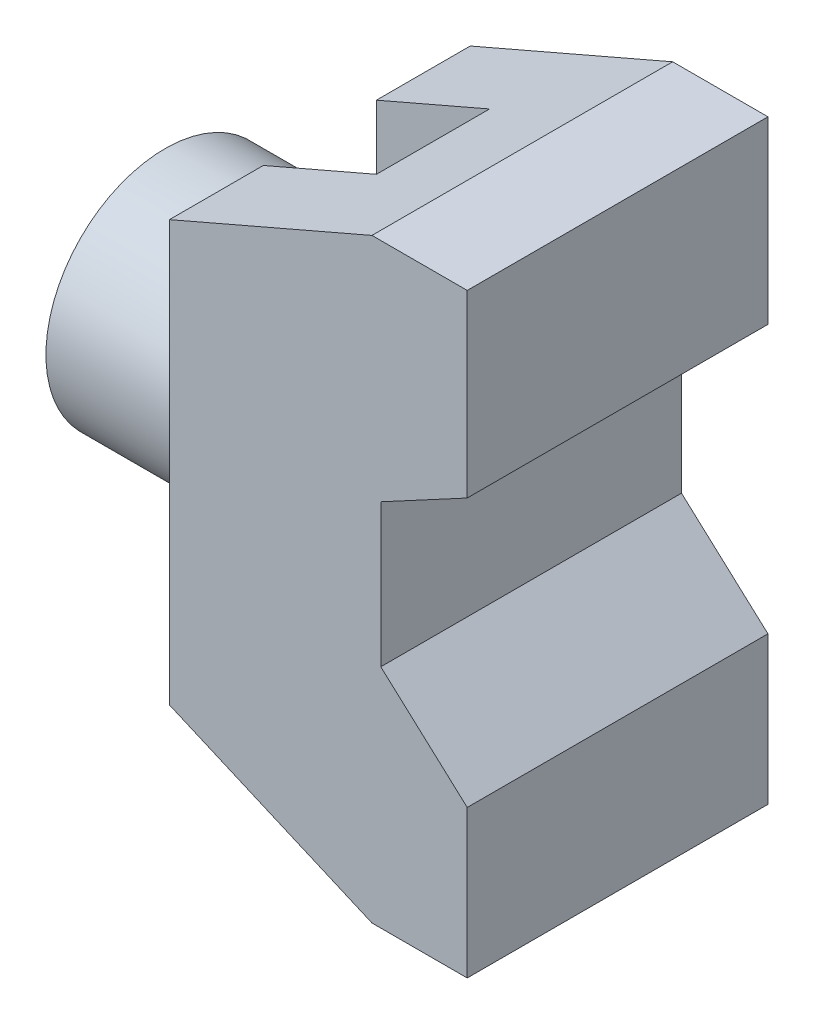
ISO-10303-21;
HEADER;
FILE_DESCRIPTION(('STEP AP214'),'2;1');
FILE_NAME('part.step','',(''),(''),'','','');
FILE_SCHEMA(('AUTOMOTIVE_DESIGN { 1 0 10303 214 1 1 1 1 }'));
ENDSEC;
DATA;
#1=APPLICATION_CONTEXT('core data for automotive mechanical design processes');
#2=APPLICATION_PROTOCOL_DEFINITION('international standard','automotive_design',2000,#1);
#3=PRODUCT_CONTEXT('',#1,'mechanical');
#4=PRODUCT('Part','Part','',(#3));
#5=PRODUCT_RELATED_PRODUCT_CATEGORY('part','',(#4));
#6=PRODUCT_DEFINITION_FORMATION('','',#4);
#7=PRODUCT_DEFINITION_CONTEXT('part definition',#1,'design');
#8=PRODUCT_DEFINITION('design','',#6,#7);
#9=PRODUCT_DEFINITION_SHAPE('','',#8);
#10=(LENGTH_UNIT() NAMED_UNIT(*) SI_UNIT(.MILLI.,.METRE.));
#11=(NAMED_UNIT(*) PLANE_ANGLE_UNIT() SI_UNIT($,.RADIAN.));
#12=(NAMED_UNIT(*) SI_UNIT($,.STERADIAN.) SOLID_ANGLE_UNIT());
#13=UNCERTAINTY_MEASURE_WITH_UNIT(LENGTH_MEASURE(1.E-05),#10,'distance_accuracy_value','');
#14=(GEOMETRIC_REPRESENTATION_CONTEXT(3) GLOBAL_UNCERTAINTY_ASSIGNED_CONTEXT((#13)) GLOBAL_UNIT_ASSIGNED_CONTEXT((#10,
#11,#12)) REPRESENTATION_CONTEXT('',''));
#15=CARTESIAN_POINT('',(0.,0.,0.));
#16=DIRECTION('',(0.,0.,1.));
#17=DIRECTION('',(1.,0.,0.));
#18=AXIS2_PLACEMENT_3D('',#15,#16,#17);
#19=CARTESIAN_POINT('',(76.,0.,0.));
#20=DIRECTION('',(1.,0.,0.));
#21=DIRECTION('',(0.,0.,-1.));
#22=AXIS2_PLACEMENT_3D('',#19,#20,#21);
#23=PLANE('',#22);
#24=DIRECTION('',(0.,0.,-1.));
#25=VECTOR('',#24,1.);
#26=CARTESIAN_POINT('',(76.,-25.1927502263372,25.25));
#27=LINE('',#26,#25);
#28=CARTESIAN_POINT('',(76.,-25.1927502263372,25.25));
#29=VERTEX_POINT('',#28);
#30=CARTESIAN_POINT('',(76.,-25.1927502263372,-25.25));
#31=VERTEX_POINT('',#30);
#32=EDGE_CURVE('E192',#29,#31,#27,.T.);
#33=ORIENTED_EDGE('',*,*,#32,.F.);
#34=DIRECTION('',(0.,-1.,0.));
#35=VECTOR('',#34,1.);
#36=CARTESIAN_POINT('',(76.,50.,25.25));
#37=LINE('',#36,#35);
#38=CARTESIAN_POINT('',(76.,-50.,25.25));
#39=VERTEX_POINT('',#38);
#40=EDGE_CURVE('E184',#29,#39,#37,.T.);
#41=ORIENTED_EDGE('',*,*,#40,.T.);
#42=DIRECTION('',(0.,0.,-1.));
#43=VECTOR('',#42,1.);
#44=CARTESIAN_POINT('',(76.,-50.,25.25));
#45=LINE('',#44,#43);
#46=CARTESIAN_POINT('',(76.,-50.,-25.25));
#47=VERTEX_POINT('',#46);
#48=EDGE_CURVE('E252',#39,#47,#45,.T.);
#49=ORIENTED_EDGE('',*,*,#48,.T.);
#50=DIRECTION('',(0.,1.,0.));
#51=VECTOR('',#50,1.);
#52=CARTESIAN_POINT('',(76.,50.,-25.25));
#53=LINE('',#52,#51);
#54=EDGE_CURVE('E243',#47,#31,#53,.T.);
#55=ORIENTED_EDGE('',*,*,#54,.T.);
#56=EDGE_LOOP('',(#33,#41,#49,#55));
#57=FACE_BOUND('',#56,.T.);
#58=ADVANCED_FACE('F37',(#57),#23,.T.);
#59=CARTESIAN_POINT('',(26.,0.,0.));
#60=DIRECTION('',(1.,0.,0.));
#61=DIRECTION('',(0.,0.,-1.));
#62=AXIS2_PLACEMENT_3D('',#59,#60,#61);
#63=PLANE('',#62);
#64=DIRECTION('',(0.,-1.,0.));
#65=VECTOR('',#64,1.);
#66=CARTESIAN_POINT('',(26.,50.,25.25));
#67=LINE('',#66,#65);
#68=CARTESIAN_POINT('',(26.,35.2949429035414,25.25));
#69=VERTEX_POINT('',#68);
#70=CARTESIAN_POINT('',(26.,-35.2949429035414,25.25));
#71=VERTEX_POINT('',#70);
#72=EDGE_CURVE('E258',#69,#71,#67,.T.);
#73=ORIENTED_EDGE('',*,*,#72,.F.);
#74=DIRECTION('',(0.,0.,-1.));
#75=VECTOR('',#74,1.);
#76=CARTESIAN_POINT('',(26.,35.2949429035414,25.25));
#77=LINE('',#76,#75);
#78=CARTESIAN_POINT('',(26.,35.2949429035414,9.5));
#79=VERTEX_POINT('',#78);
#80=EDGE_CURVE('E207',#69,#79,#77,.T.);
#81=ORIENTED_EDGE('',*,*,#80,.T.);
#82=DIRECTION('',(0.,-1.,0.));
#83=VECTOR('',#82,1.);
#84=CARTESIAN_POINT('',(26.,50.,9.5));
#85=LINE('',#84,#83);
#86=CARTESIAN_POINT('',(26.,17.599715906798,9.5));
#87=VERTEX_POINT('',#86);
#88=EDGE_CURVE('E229',#79,#87,#85,.T.);
#89=ORIENTED_EDGE('',*,*,#88,.T.);
#90=CARTESIAN_POINT('',(26.,0.,0.));
#91=DIRECTION('',(1.,0.,0.));
#92=DIRECTION('',(0.,0.,-1.));
#93=AXIS2_PLACEMENT_3D('',#90,#91,#92);
#94=CIRCLE('',#93,20.);
#95=CARTESIAN_POINT('',(26.,-17.599715906798,9.5));
#96=VERTEX_POINT('',#95);
#97=EDGE_CURVE('E285',#87,#96,#94,.T.);
#98=ORIENTED_EDGE('',*,*,#97,.T.);
#99=DIRECTION('',(0.,-1.,0.));
#100=VECTOR('',#99,1.);
#101=CARTESIAN_POINT('',(26.,0.,9.5));
#102=LINE('',#101,#100);
#103=CARTESIAN_POINT('',(26.,-35.2949429035414,9.5));
#104=VERTEX_POINT('',#103);
#105=EDGE_CURVE('E290',#96,#104,#102,.T.);
#106=ORIENTED_EDGE('',*,*,#105,.T.);
#107=DIRECTION('',(0.,0.,-1.));
#108=VECTOR('',#107,1.);
#109=CARTESIAN_POINT('',(26.,-35.2949429035414,25.25));
#110=LINE('',#109,#108);
#111=EDGE_CURVE('E210',#71,#104,#110,.T.);
#112=ORIENTED_EDGE('',*,*,#111,.F.);
#113=EDGE_LOOP('',(#73,#81,#89,#98,#106,#112));
#114=FACE_BOUND('',#113,.T.);
#115=ADVANCED_FACE('F350',(#114),#63,.F.);
#116=CARTESIAN_POINT('',(76.,50.,-25.25));
#117=DIRECTION('',(0.,0.,1.));
#118=DIRECTION('',(0.,-1.,0.));
#119=AXIS2_PLACEMENT_3D('',#116,#117,#118);
#120=PLANE('',#119);
#121=DIRECTION('',(0.,1.,0.));
#122=VECTOR('',#121,1.);
#123=CARTESIAN_POINT('',(61.4835075856124,12.,-25.25));
#124=LINE('',#123,#122);
#125=CARTESIAN_POINT('',(61.4835075856124,-12.,-25.25));
#126=VERTEX_POINT('',#125);
#127=CARTESIAN_POINT('',(61.4835075856124,12.,-25.25));
#128=VERTEX_POINT('',#127);
#129=EDGE_CURVE('E186',#126,#128,#124,.T.);
#130=ORIENTED_EDGE('',*,*,#129,.F.);
#131=DIRECTION('',(-0.740043111651384,0.67255943447203,0.));
#132=VECTOR('',#131,1.);
#133=CARTESIAN_POINT('',(61.4835075856124,-12.,-25.25));
#134=LINE('',#133,#132);
#135=EDGE_CURVE('E167',#31,#126,#134,.T.);
#136=ORIENTED_EDGE('',*,*,#135,.F.);
#137=ORIENTED_EDGE('',*,*,#54,.F.);
#138=DIRECTION('',(-1.,0.,0.));
#139=VECTOR('',#138,1.);
#140=CARTESIAN_POINT('',(76.,-50.,-25.25));
#141=LINE('',#140,#139);
#142=CARTESIAN_POINT('',(60.,-50.,-25.25));
#143=VERTEX_POINT('',#142);
#144=EDGE_CURVE('E254',#47,#143,#141,.T.);
#145=ORIENTED_EDGE('',*,*,#144,.T.);
#146=DIRECTION('',(-0.917833880047673,0.396964694446035,0.));
#147=VECTOR('',#146,1.);
#148=CARTESIAN_POINT('',(60.,-50.,-25.25));
#149=LINE('',#148,#147);
#150=CARTESIAN_POINT('',(26.,-35.2949429035414,-25.25));
#151=VERTEX_POINT('',#150);
#152=EDGE_CURVE('E203',#143,#151,#149,.T.);
#153=ORIENTED_EDGE('',*,*,#152,.T.);
#154=DIRECTION('',(0.,1.,0.));
#155=VECTOR('',#154,1.);
#156=CARTESIAN_POINT('',(26.,50.,-25.25));
#157=LINE('',#156,#155);
#158=CARTESIAN_POINT('',(26.,35.2949429035414,-25.25));
#159=VERTEX_POINT('',#158);
#160=EDGE_CURVE('E255',#151,#159,#157,.T.);
#161=ORIENTED_EDGE('',*,*,#160,.T.);
#162=DIRECTION('',(-0.917833880047673,-0.396964694446035,0.));
#163=VECTOR('',#162,1.);
#164=CARTESIAN_POINT('',(60.,50.,-25.25));
#165=LINE('',#164,#163);
#166=CARTESIAN_POINT('',(60.,50.,-25.25));
#167=VERTEX_POINT('',#166);
#168=EDGE_CURVE('E201',#167,#159,#165,.T.);
#169=ORIENTED_EDGE('',*,*,#168,.F.);
#170=DIRECTION('',(-1.,0.,0.));
#171=VECTOR('',#170,1.);
#172=CARTESIAN_POINT('',(76.,50.,-25.25));
#173=LINE('',#172,#171);
#174=CARTESIAN_POINT('',(76.,50.,-25.25));
#175=VERTEX_POINT('',#174);
#176=EDGE_CURVE('E269',#175,#167,#173,.T.);
#177=ORIENTED_EDGE('',*,*,#176,.F.);
#178=CARTESIAN_POINT('',(76.,19.8072497736628,-25.25));
#179=VERTEX_POINT('',#178);
#180=EDGE_CURVE('E247',#179,#175,#53,.T.);
#181=ORIENTED_EDGE('',*,*,#180,.F.);
#182=DIRECTION('',(0.880707100206876,0.473661275222279,0.));
#183=VECTOR('',#182,1.);
#184=CARTESIAN_POINT('',(61.4835075856124,12.,-25.25));
#185=LINE('',#184,#183);
#186=EDGE_CURVE('E52',#128,#179,#185,.T.);
#187=ORIENTED_EDGE('',*,*,#186,.F.);
#188=EDGE_LOOP('',(#130,#136,#137,#145,#153,#161,#169,#177,#181,#187));
#189=FACE_BOUND('',#188,.T.);
#190=ADVANCED_FACE('F371',(#189),#120,.F.);
#191=CARTESIAN_POINT('',(76.,50.,25.25));
#192=DIRECTION('',(0.,0.,-1.));
#193=DIRECTION('',(0.,1.,0.));
#194=AXIS2_PLACEMENT_3D('',#191,#192,#193);
#195=PLANE('',#194);
#196=ORIENTED_EDGE('',*,*,#40,.F.);
#197=DIRECTION('',(-0.740043111651384,0.67255943447203,0.));
#198=VECTOR('',#197,1.);
#199=CARTESIAN_POINT('',(61.4835075856124,-12.,25.25));
#200=LINE('',#199,#198);
#201=CARTESIAN_POINT('',(61.4835075856124,-12.,25.25));
#202=VERTEX_POINT('',#201);
#203=EDGE_CURVE('E164',#29,#202,#200,.T.);
#204=ORIENTED_EDGE('',*,*,#203,.T.);
#205=DIRECTION('',(0.,1.,0.));
#206=VECTOR('',#205,1.);
#207=CARTESIAN_POINT('',(61.4835075856124,12.,25.25));
#208=LINE('',#207,#206);
#209=CARTESIAN_POINT('',(61.4835075856124,12.,25.25));
#210=VERTEX_POINT('',#209);
#211=EDGE_CURVE('E175',#202,#210,#208,.T.);
#212=ORIENTED_EDGE('',*,*,#211,.T.);
#213=DIRECTION('',(0.880707100206876,0.473661275222279,0.));
#214=VECTOR('',#213,1.);
#215=CARTESIAN_POINT('',(61.4835075856124,12.,25.25));
#216=LINE('',#215,#214);
#217=CARTESIAN_POINT('',(76.,19.8072497736628,25.25));
#218=VERTEX_POINT('',#217);
#219=EDGE_CURVE('E172',#210,#218,#216,.T.);
#220=ORIENTED_EDGE('',*,*,#219,.T.);
#221=CARTESIAN_POINT('',(76.,50.,25.25));
#222=VERTEX_POINT('',#221);
#223=EDGE_CURVE('E249',#222,#218,#37,.T.);
#224=ORIENTED_EDGE('',*,*,#223,.F.);
#225=DIRECTION('',(-1.,0.,0.));
#226=VECTOR('',#225,1.);
#227=CARTESIAN_POINT('',(76.,50.,25.25));
#228=LINE('',#227,#226);
#229=CARTESIAN_POINT('',(60.,50.,25.25));
#230=VERTEX_POINT('',#229);
#231=EDGE_CURVE('E266',#222,#230,#228,.T.);
#232=ORIENTED_EDGE('',*,*,#231,.T.);
#233=DIRECTION('',(-0.917833880047673,-0.396964694446035,0.));
#234=VECTOR('',#233,1.);
#235=CARTESIAN_POINT('',(60.,50.,25.25));
#236=LINE('',#235,#234);
#237=EDGE_CURVE('E198',#230,#69,#236,.T.);
#238=ORIENTED_EDGE('',*,*,#237,.T.);
#239=ORIENTED_EDGE('',*,*,#72,.T.);
#240=DIRECTION('',(-0.917833880047673,0.396964694446035,0.));
#241=VECTOR('',#240,1.);
#242=CARTESIAN_POINT('',(60.,-50.,25.25));
#243=LINE('',#242,#241);
#244=CARTESIAN_POINT('',(60.,-50.,25.25));
#245=VERTEX_POINT('',#244);
#246=EDGE_CURVE('E212',#245,#71,#243,.T.);
#247=ORIENTED_EDGE('',*,*,#246,.F.);
#248=DIRECTION('',(-1.,0.,0.));
#249=VECTOR('',#248,1.);
#250=CARTESIAN_POINT('',(76.,-50.,25.25));
#251=LINE('',#250,#249);
#252=EDGE_CURVE('E263',#39,#245,#251,.T.);
#253=ORIENTED_EDGE('',*,*,#252,.F.);
#254=EDGE_LOOP('',(#196,#204,#212,#220,#224,#232,#238,#239,#247,#253));
#255=FACE_BOUND('',#254,.T.);
#256=ADVANCED_FACE('F182',(#255),#195,.F.);
#257=CARTESIAN_POINT('',(76.,-50.,25.25));
#258=DIRECTION('',(0.,1.,0.));
#259=DIRECTION('',(0.,0.,1.));
#260=AXIS2_PLACEMENT_3D('',#257,#258,#259);
#261=PLANE('',#260);
#262=DIRECTION('',(0.,0.,-1.));
#263=VECTOR('',#262,1.);
#264=CARTESIAN_POINT('',(60.,-50.,25.25));
#265=LINE('',#264,#263);
#266=EDGE_CURVE('E194',#245,#143,#265,.T.);
#267=ORIENTED_EDGE('',*,*,#266,.T.);
#268=ORIENTED_EDGE('',*,*,#144,.F.);
#269=ORIENTED_EDGE('',*,*,#48,.F.);
#270=ORIENTED_EDGE('',*,*,#252,.T.);
#271=EDGE_LOOP('',(#267,#268,#269,#270));
#272=FACE_BOUND('',#271,.T.);
#273=ADVANCED_FACE('F395',(#272),#261,.F.);
#274=DIRECTION('',(0.,-1.,0.));
#275=VECTOR('',#274,1.);
#276=CARTESIAN_POINT('',(26.,50.,-9.5));
#277=LINE('',#276,#275);
#278=CARTESIAN_POINT('',(26.,35.2949429035414,-9.5));
#279=VERTEX_POINT('',#278);
#280=CARTESIAN_POINT('',(26.,17.599715906798,-9.5));
#281=VERTEX_POINT('',#280);
#282=EDGE_CURVE('E240',#279,#281,#277,.T.);
#283=ORIENTED_EDGE('',*,*,#282,.F.);
#284=EDGE_CURVE('E60',#279,#159,#77,.T.);
#285=ORIENTED_EDGE('',*,*,#284,.T.);
#286=ORIENTED_EDGE('',*,*,#160,.F.);
#287=CARTESIAN_POINT('',(26.,-35.2949429035414,-9.5));
#288=VERTEX_POINT('',#287);
#289=EDGE_CURVE('E213',#288,#151,#110,.T.);
#290=ORIENTED_EDGE('',*,*,#289,.F.);
#291=DIRECTION('',(0.,1.,0.));
#292=VECTOR('',#291,1.);
#293=CARTESIAN_POINT('',(26.,0.,-9.5));
#294=LINE('',#293,#292);
#295=CARTESIAN_POINT('',(26.,-17.599715906798,-9.5));
#296=VERTEX_POINT('',#295);
#297=EDGE_CURVE('E284',#288,#296,#294,.T.);
#298=ORIENTED_EDGE('',*,*,#297,.T.);
#299=EDGE_CURVE('E286',#296,#281,#94,.T.);
#300=ORIENTED_EDGE('',*,*,#299,.T.);
#301=EDGE_LOOP('',(#283,#285,#286,#290,#298,#300));
#302=FACE_BOUND('',#301,.T.);
#303=ADVANCED_FACE('F303',(#302),#63,.F.);
#304=CARTESIAN_POINT('',(26.,50.,9.5));
#305=DIRECTION('',(0.,0.,1.));
#306=DIRECTION('',(1.,0.,0.));
#307=AXIS2_PLACEMENT_3D('',#304,#305,#306);
#308=PLANE('',#307);
#309=ORIENTED_EDGE('',*,*,#88,.F.);
#310=DIRECTION('',(0.917833880047673,0.396964694446035,0.));
#311=VECTOR('',#310,1.);
#312=CARTESIAN_POINT('',(31.3577529336455,37.6121800446584,9.5));
#313=LINE('',#312,#311);
#314=CARTESIAN_POINT('',(45.,43.5124748103859,9.5));
#315=VERTEX_POINT('',#314);
#316=EDGE_CURVE('E225',#79,#315,#313,.T.);
#317=ORIENTED_EDGE('',*,*,#316,.T.);
#318=DIRECTION('',(0.,-1.,0.));
#319=VECTOR('',#318,1.);
#320=CARTESIAN_POINT('',(45.,50.,9.5));
#321=LINE('',#320,#319);
#322=CARTESIAN_POINT('',(45.,-43.5124748103859,9.5));
#323=VERTEX_POINT('',#322);
#324=EDGE_CURVE('E234',#315,#323,#321,.T.);
#325=ORIENTED_EDGE('',*,*,#324,.T.);
#326=DIRECTION('',(0.917833880047673,-0.396964694446035,0.));
#327=VECTOR('',#326,1.);
#328=CARTESIAN_POINT('',(-5.07701164088875,-21.854083180995,9.5));
#329=LINE('',#328,#327);
#330=EDGE_CURVE('E220',#104,#323,#329,.T.);
#331=ORIENTED_EDGE('',*,*,#330,.F.);
#332=ORIENTED_EDGE('',*,*,#105,.F.);
#333=CARTESIAN_POINT('',(26.,-3.1224989991992,9.5));
#334=VERTEX_POINT('',#333);
#335=EDGE_CURVE('E233',#334,#96,#85,.T.);
#336=ORIENTED_EDGE('',*,*,#335,.F.);
#337=CARTESIAN_POINT('',(26.,3.1224989991992,9.5));
#338=VERTEX_POINT('',#337);
#339=EDGE_CURVE('E342',#338,#334,#85,.T.);
#340=ORIENTED_EDGE('',*,*,#339,.F.);
#341=EDGE_CURVE('E232',#87,#338,#85,.T.);
#342=ORIENTED_EDGE('',*,*,#341,.F.);
#343=EDGE_LOOP('',(#309,#317,#325,#331,#332,#336,#340,#342));
#344=FACE_BOUND('',#343,.T.);
#345=ADVANCED_FACE('F345',(#344),#308,.F.);
#346=CARTESIAN_POINT('',(45.,50.,9.5));
#347=DIRECTION('',(1.,0.,0.));
#348=DIRECTION('',(0.,0.,-1.));
#349=AXIS2_PLACEMENT_3D('',#346,#347,#348);
#350=PLANE('',#349);
#351=ORIENTED_EDGE('',*,*,#324,.F.);
#352=DIRECTION('',(0.,0.,-1.));
#353=VECTOR('',#352,1.);
#354=CARTESIAN_POINT('',(45.,43.5124748103859,9.5));
#355=LINE('',#354,#353);
#356=CARTESIAN_POINT('',(45.,43.5124748103859,-9.5));
#357=VERTEX_POINT('',#356);
#358=EDGE_CURVE('E222',#315,#357,#355,.T.);
#359=ORIENTED_EDGE('',*,*,#358,.T.);
#360=DIRECTION('',(0.,-1.,0.));
#361=VECTOR('',#360,1.);
#362=CARTESIAN_POINT('',(45.,50.,-9.5));
#363=LINE('',#362,#361);
#364=CARTESIAN_POINT('',(45.,-43.5124748103859,-9.5));
#365=VERTEX_POINT('',#364);
#366=EDGE_CURVE('E237',#357,#365,#363,.T.);
#367=ORIENTED_EDGE('',*,*,#366,.T.);
#368=DIRECTION('',(0.,0.,-1.));
#369=VECTOR('',#368,1.);
#370=CARTESIAN_POINT('',(45.,-43.5124748103859,9.49999999999998));
#371=LINE('',#370,#369);
#372=EDGE_CURVE('E206',#323,#365,#371,.T.);
#373=ORIENTED_EDGE('',*,*,#372,.F.);
#374=EDGE_LOOP('',(#351,#359,#367,#373));
#375=FACE_BOUND('',#374,.T.);
#376=ADVANCED_FACE('F353',(#375),#350,.F.);
#377=CARTESIAN_POINT('',(26.,50.,-9.5));
#378=DIRECTION('',(0.,0.,-1.));
#379=DIRECTION('',(-1.,0.,0.));
#380=AXIS2_PLACEMENT_3D('',#377,#378,#379);
#381=PLANE('',#380);
#382=ORIENTED_EDGE('',*,*,#366,.F.);
#383=DIRECTION('',(-0.917833880047673,-0.396964694446035,0.));
#384=VECTOR('',#383,1.);
#385=CARTESIAN_POINT('',(31.3577529336455,37.6121800446584,-9.5));
#386=LINE('',#385,#384);
#387=EDGE_CURVE('E11',#357,#279,#386,.T.);
#388=ORIENTED_EDGE('',*,*,#387,.T.);
#389=ORIENTED_EDGE('',*,*,#282,.T.);
#390=CARTESIAN_POINT('',(26.,3.12249899919921,-9.5));
#391=VERTEX_POINT('',#390);
#392=EDGE_CURVE('E242',#281,#391,#277,.T.);
#393=ORIENTED_EDGE('',*,*,#392,.T.);
#394=CARTESIAN_POINT('',(26.,-3.1224989991992,-9.5));
#395=VERTEX_POINT('',#394);
#396=EDGE_CURVE('E310',#391,#395,#277,.T.);
#397=ORIENTED_EDGE('',*,*,#396,.T.);
#398=EDGE_CURVE('E228',#395,#296,#277,.T.);
#399=ORIENTED_EDGE('',*,*,#398,.T.);
#400=ORIENTED_EDGE('',*,*,#297,.F.);
#401=DIRECTION('',(-0.917833880047673,0.396964694446035,0.));
#402=VECTOR('',#401,1.);
#403=CARTESIAN_POINT('',(-5.07701164088875,-21.854083180995,-9.49999999999999));
#404=LINE('',#403,#402);
#405=EDGE_CURVE('E45',#365,#288,#404,.T.);
#406=ORIENTED_EDGE('',*,*,#405,.F.);
#407=EDGE_LOOP('',(#382,#388,#389,#393,#397,#399,#400,#406));
#408=FACE_BOUND('',#407,.T.);
#409=ADVANCED_FACE('F306',(#408),#381,.F.);
#410=ORIENTED_EDGE('',*,*,#396,.F.);
#411=CARTESIAN_POINT('',(26.,0.,0.));
#412=DIRECTION('',(1.,0.,0.));
#413=DIRECTION('',(0.,0.,-1.));
#414=AXIS2_PLACEMENT_3D('',#411,#412,#413);
#415=CIRCLE('',#414,10.);
#416=EDGE_CURVE('E272',#395,#391,#415,.T.);
#417=ORIENTED_EDGE('',*,*,#416,.F.);
#418=EDGE_LOOP('',(#410,#417));
#419=FACE_BOUND('',#418,.T.);
#420=ADVANCED_FACE('F335',(#419),#63,.F.);
#421=CARTESIAN_POINT('',(0.,0.,0.));
#422=DIRECTION('',(1.,0.,0.));
#423=DIRECTION('',(0.,0.,-1.));
#424=AXIS2_PLACEMENT_3D('',#421,#422,#423);
#425=PLANE('',#424);
#426=CARTESIAN_POINT('',(0.,0.,0.));
#427=DIRECTION('',(1.,0.,0.));
#428=DIRECTION('',(0.,0.,-1.));
#429=AXIS2_PLACEMENT_3D('',#426,#427,#428);
#430=CIRCLE('',#429,20.);
#431=CARTESIAN_POINT('',(0.,0.,-20.));
#432=VERTEX_POINT('',#431);
#433=EDGE_CURVE('E280',#432,#432,#430,.T.);
#434=ORIENTED_EDGE('',*,*,#433,.F.);
#435=EDGE_LOOP('',(#434));
#436=FACE_BOUND('',#435,.T.);
#437=CARTESIAN_POINT('',(0.,0.,0.));
#438=DIRECTION('',(1.,0.,0.));
#439=DIRECTION('',(0.,0.,-1.));
#440=AXIS2_PLACEMENT_3D('',#437,#438,#439);
#441=CIRCLE('',#440,10.);
#442=CARTESIAN_POINT('',(0.,0.,-10.));
#443=VERTEX_POINT('',#442);
#444=EDGE_CURVE('E276',#443,#443,#441,.T.);
#445=ORIENTED_EDGE('',*,*,#444,.T.);
#446=EDGE_LOOP('',(#445));
#447=FACE_BOUND('',#446,.T.);
#448=ADVANCED_FACE('F408',(#436,#447),#425,.F.);
#449=CARTESIAN_POINT('',(26.,0.,0.));
#450=DIRECTION('',(-1.,0.,0.));
#451=DIRECTION('',(0.,0.,1.));
#452=AXIS2_PLACEMENT_3D('',#449,#450,#451);
#453=CYLINDRICAL_SURFACE('',#452,20.);
#454=EDGE_CURVE('E281',#281,#87,#94,.T.);
#455=ORIENTED_EDGE('',*,*,#454,.F.);
#456=ORIENTED_EDGE('',*,*,#299,.F.);
#457=EDGE_CURVE('E315',#96,#296,#94,.T.);
#458=ORIENTED_EDGE('',*,*,#457,.F.);
#459=ORIENTED_EDGE('',*,*,#97,.F.);
#460=EDGE_LOOP('',(#455,#456,#458,#459));
#461=FACE_BOUND('',#460,.T.);
#462=ORIENTED_EDGE('',*,*,#433,.T.);
#463=EDGE_LOOP('',(#462));
#464=FACE_BOUND('',#463,.T.);
#465=ADVANCED_FACE('F39',(#461,#464),#453,.T.);
#466=CARTESIAN_POINT('',(26.,0.,0.));
#467=DIRECTION('',(-1.,0.,0.));
#468=DIRECTION('',(0.,0.,1.));
#469=AXIS2_PLACEMENT_3D('',#466,#467,#468);
#470=CYLINDRICAL_SURFACE('',#469,10.);
#471=EDGE_CURVE('E273',#391,#338,#415,.T.);
#472=ORIENTED_EDGE('',*,*,#471,.T.);
#473=EDGE_CURVE('E277',#338,#334,#415,.T.);
#474=ORIENTED_EDGE('',*,*,#473,.T.);
#475=EDGE_CURVE('E231',#334,#395,#415,.T.);
#476=ORIENTED_EDGE('',*,*,#475,.T.);
#477=ORIENTED_EDGE('',*,*,#416,.T.);
#478=EDGE_LOOP('',(#472,#474,#476,#477));
#479=FACE_BOUND('',#478,.T.);
#480=ORIENTED_EDGE('',*,*,#444,.F.);
#481=EDGE_LOOP('',(#480));
#482=FACE_BOUND('',#481,.T.);
#483=ADVANCED_FACE('F337',(#479,#482),#470,.F.);
#484=ORIENTED_EDGE('',*,*,#473,.F.);
#485=ORIENTED_EDGE('',*,*,#339,.T.);
#486=EDGE_LOOP('',(#484,#485));
#487=FACE_BOUND('',#486,.T.);
#488=ADVANCED_FACE('F341',(#487),#63,.F.);
#489=CARTESIAN_POINT('',(76.,50.,25.25));
#490=DIRECTION('',(0.,-1.,0.));
#491=DIRECTION('',(0.,0.,-1.));
#492=AXIS2_PLACEMENT_3D('',#489,#490,#491);
#493=PLANE('',#492);
#494=ORIENTED_EDGE('',*,*,#176,.T.);
#495=DIRECTION('',(0.,0.,-1.));
#496=VECTOR('',#495,1.);
#497=CARTESIAN_POINT('',(60.,50.,25.25));
#498=LINE('',#497,#496);
#499=EDGE_CURVE('E204',#230,#167,#498,.T.);
#500=ORIENTED_EDGE('',*,*,#499,.F.);
#501=ORIENTED_EDGE('',*,*,#231,.F.);
#502=DIRECTION('',(0.,0.,1.));
#503=VECTOR('',#502,1.);
#504=CARTESIAN_POINT('',(76.,50.,25.25));
#505=LINE('',#504,#503);
#506=EDGE_CURVE('E246',#175,#222,#505,.T.);
#507=ORIENTED_EDGE('',*,*,#506,.F.);
#508=EDGE_LOOP('',(#494,#500,#501,#507));
#509=FACE_BOUND('',#508,.T.);
#510=ADVANCED_FACE('F375',(#509),#493,.F.);
#511=DIRECTION('',(0.,0.,-1.));
#512=VECTOR('',#511,1.);
#513=CARTESIAN_POINT('',(76.,19.8072497736628,25.25));
#514=LINE('',#513,#512);
#515=EDGE_CURVE('E195',#218,#179,#514,.T.);
#516=ORIENTED_EDGE('',*,*,#515,.T.);
#517=ORIENTED_EDGE('',*,*,#180,.T.);
#518=ORIENTED_EDGE('',*,*,#506,.T.);
#519=ORIENTED_EDGE('',*,*,#223,.T.);
#520=EDGE_LOOP('',(#516,#517,#518,#519));
#521=FACE_BOUND('',#520,.T.);
#522=ADVANCED_FACE('F367',(#521),#23,.T.);
#523=CARTESIAN_POINT('',(26.,50.,9.5));
#524=DIRECTION('',(-1.,0.,0.));
#525=DIRECTION('',(0.,0.,1.));
#526=AXIS2_PLACEMENT_3D('',#523,#524,#525);
#527=PLANE('',#526);
#528=ORIENTED_EDGE('',*,*,#392,.F.);
#529=ORIENTED_EDGE('',*,*,#454,.T.);
#530=ORIENTED_EDGE('',*,*,#341,.T.);
#531=ORIENTED_EDGE('',*,*,#471,.F.);
#532=EDGE_LOOP('',(#528,#529,#530,#531));
#533=FACE_BOUND('',#532,.T.);
#534=ADVANCED_FACE('F327',(#533),#527,.F.);
#535=ORIENTED_EDGE('',*,*,#335,.T.);
#536=ORIENTED_EDGE('',*,*,#457,.T.);
#537=ORIENTED_EDGE('',*,*,#398,.F.);
#538=ORIENTED_EDGE('',*,*,#475,.F.);
#539=EDGE_LOOP('',(#535,#536,#537,#538));
#540=FACE_BOUND('',#539,.T.);
#541=ADVANCED_FACE('F317',(#540),#527,.F.);
#542=CARTESIAN_POINT('',(60.,-50.,25.25));
#543=DIRECTION('',(-0.396964694446035,-0.917833880047673,0.));
#544=DIRECTION('',(0.917833880047673,-0.396964694446035,0.));
#545=AXIS2_PLACEMENT_3D('',#542,#543,#544);
#546=PLANE('',#545);
#547=ORIENTED_EDGE('',*,*,#330,.T.);
#548=ORIENTED_EDGE('',*,*,#372,.T.);
#549=ORIENTED_EDGE('',*,*,#405,.T.);
#550=ORIENTED_EDGE('',*,*,#289,.T.);
#551=ORIENTED_EDGE('',*,*,#152,.F.);
#552=ORIENTED_EDGE('',*,*,#266,.F.);
#553=ORIENTED_EDGE('',*,*,#246,.T.);
#554=ORIENTED_EDGE('',*,*,#111,.T.);
#555=EDGE_LOOP('',(#547,#548,#549,#550,#551,#552,#553,#554));
#556=FACE_BOUND('',#555,.T.);
#557=ADVANCED_FACE('F295',(#556),#546,.T.);
#558=CARTESIAN_POINT('',(60.,50.,25.25));
#559=DIRECTION('',(0.396964694446035,-0.917833880047673,0.));
#560=DIRECTION('',(0.917833880047673,0.396964694446035,0.));
#561=AXIS2_PLACEMENT_3D('',#558,#559,#560);
#562=PLANE('',#561);
#563=ORIENTED_EDGE('',*,*,#80,.F.);
#564=ORIENTED_EDGE('',*,*,#237,.F.);
#565=ORIENTED_EDGE('',*,*,#499,.T.);
#566=ORIENTED_EDGE('',*,*,#168,.T.);
#567=ORIENTED_EDGE('',*,*,#284,.F.);
#568=ORIENTED_EDGE('',*,*,#387,.F.);
#569=ORIENTED_EDGE('',*,*,#358,.F.);
#570=ORIENTED_EDGE('',*,*,#316,.F.);
#571=EDGE_LOOP('',(#563,#564,#565,#566,#567,#568,#569,#570));
#572=FACE_BOUND('',#571,.T.);
#573=ADVANCED_FACE('F354',(#572),#562,.F.);
#574=CARTESIAN_POINT('',(61.4835075856124,-12.,25.25));
#575=DIRECTION('',(-0.67255943447203,-0.740043111651384,0.));
#576=DIRECTION('',(0.740043111651384,-0.67255943447203,0.));
#577=AXIS2_PLACEMENT_3D('',#574,#575,#576);
#578=PLANE('',#577);
#579=ORIENTED_EDGE('',*,*,#135,.T.);
#580=DIRECTION('',(0.,0.,-1.));
#581=VECTOR('',#580,1.);
#582=CARTESIAN_POINT('',(61.4835075856124,-12.,25.25));
#583=LINE('',#582,#581);
#584=EDGE_CURVE('E160',#202,#126,#583,.T.);
#585=ORIENTED_EDGE('',*,*,#584,.F.);
#586=ORIENTED_EDGE('',*,*,#203,.F.);
#587=ORIENTED_EDGE('',*,*,#32,.T.);
#588=EDGE_LOOP('',(#579,#585,#586,#587));
#589=FACE_BOUND('',#588,.T.);
#590=ADVANCED_FACE('F162',(#589),#578,.F.);
#591=CARTESIAN_POINT('',(61.4835075856124,12.,25.25));
#592=DIRECTION('',(-0.473661275222279,0.880707100206876,0.));
#593=DIRECTION('',(-0.880707100206876,-0.473661275222279,0.));
#594=AXIS2_PLACEMENT_3D('',#591,#592,#593);
#595=PLANE('',#594);
#596=ORIENTED_EDGE('',*,*,#186,.T.);
#597=ORIENTED_EDGE('',*,*,#515,.F.);
#598=ORIENTED_EDGE('',*,*,#219,.F.);
#599=DIRECTION('',(0.,0.,-1.));
#600=VECTOR('',#599,1.);
#601=CARTESIAN_POINT('',(61.4835075856124,12.,25.25));
#602=LINE('',#601,#600);
#603=EDGE_CURVE('E171',#210,#128,#602,.T.);
#604=ORIENTED_EDGE('',*,*,#603,.T.);
#605=EDGE_LOOP('',(#596,#597,#598,#604));
#606=FACE_BOUND('',#605,.T.);
#607=ADVANCED_FACE('F361',(#606),#595,.F.);
#608=CARTESIAN_POINT('',(61.4835075856124,12.,25.25));
#609=DIRECTION('',(-1.,0.,0.));
#610=DIRECTION('',(0.,0.,1.));
#611=AXIS2_PLACEMENT_3D('',#608,#609,#610);
#612=PLANE('',#611);
#613=ORIENTED_EDGE('',*,*,#129,.T.);
#614=ORIENTED_EDGE('',*,*,#603,.F.);
#615=ORIENTED_EDGE('',*,*,#211,.F.);
#616=ORIENTED_EDGE('',*,*,#584,.T.);
#617=EDGE_LOOP('',(#613,#614,#615,#616));
#618=FACE_BOUND('',#617,.T.);
#619=ADVANCED_FACE('F176',(#618),#612,.F.);
#620=CLOSED_SHELL('',(#58,#115,#190,#256,#273,#303,#345,#376,#409,#420,#448,#465,#483,#488,#510,
#522,#534,#541,#557,#573,#590,#607,#619));
#621=MANIFOLD_SOLID_BREP('B2',#620);
#622=ADVANCED_BREP_SHAPE_REPRESENTATION('',(#18,#621),#14);
#623=SHAPE_DEFINITION_REPRESENTATION(#9,#622);
ENDSEC;
END-ISO-10303-21;
